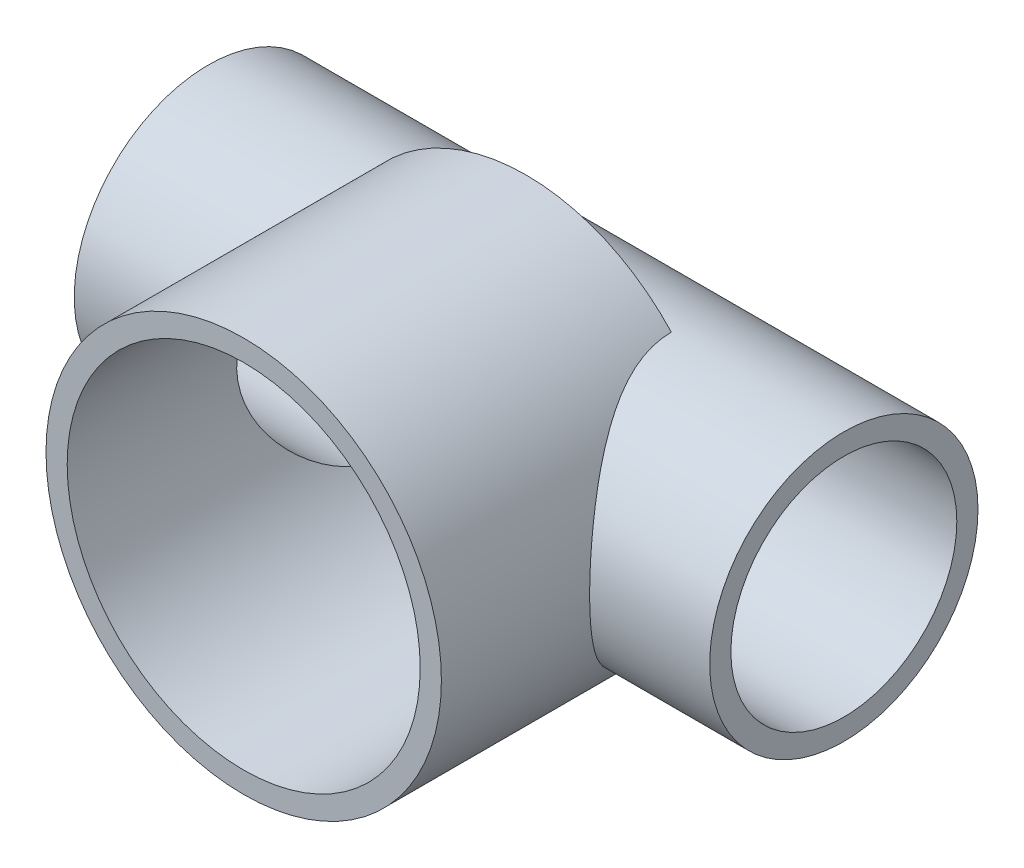
ISO-10303-21;
HEADER;
FILE_DESCRIPTION(('STEP AP214'),'2;1');
FILE_NAME('part.step','',(''),(''),'','','');
FILE_SCHEMA(('AUTOMOTIVE_DESIGN { 1 0 10303 214 1 1 1 1 }'));
ENDSEC;
DATA;
#1=APPLICATION_CONTEXT('core data for automotive mechanical design processes');
#2=APPLICATION_PROTOCOL_DEFINITION('international standard','automotive_design',2000,#1);
#3=PRODUCT_CONTEXT('',#1,'mechanical');
#4=PRODUCT('Part','Part','',(#3));
#5=PRODUCT_RELATED_PRODUCT_CATEGORY('part','',(#4));
#6=PRODUCT_DEFINITION_FORMATION('','',#4);
#7=PRODUCT_DEFINITION_CONTEXT('part definition',#1,'design');
#8=PRODUCT_DEFINITION('design','',#6,#7);
#9=PRODUCT_DEFINITION_SHAPE('','',#8);
#10=(LENGTH_UNIT() NAMED_UNIT(*) SI_UNIT(.MILLI.,.METRE.));
#11=(NAMED_UNIT(*) PLANE_ANGLE_UNIT() SI_UNIT($,.RADIAN.));
#12=(NAMED_UNIT(*) SI_UNIT($,.STERADIAN.) SOLID_ANGLE_UNIT());
#13=UNCERTAINTY_MEASURE_WITH_UNIT(LENGTH_MEASURE(1.E-05),#10,'distance_accuracy_value','');
#14=(GEOMETRIC_REPRESENTATION_CONTEXT(3) GLOBAL_UNCERTAINTY_ASSIGNED_CONTEXT((#13)) GLOBAL_UNIT_ASSIGNED_CONTEXT((#10,
#11,#12)) REPRESENTATION_CONTEXT('',''));
#15=CARTESIAN_POINT('',(0.,0.,0.));
#16=DIRECTION('',(0.,0.,1.));
#17=DIRECTION('',(1.,0.,0.));
#18=AXIS2_PLACEMENT_3D('',#15,#16,#17);
#19=CARTESIAN_POINT('',(-22.5,0.,0.));
#20=DIRECTION('',(1.,0.,0.));
#21=DIRECTION('',(0.,0.,-1.));
#22=AXIS2_PLACEMENT_3D('',#19,#20,#21);
#23=CYLINDRICAL_SURFACE('',#22,9.5);
#24=CARTESIAN_POINT('',(-22.5,0.,0.));
#25=DIRECTION('',(1.,0.,0.));
#26=DIRECTION('',(0.,0.,-1.));
#27=AXIS2_PLACEMENT_3D('',#24,#25,#26);
#28=CIRCLE('',#27,9.5);
#29=CARTESIAN_POINT('',(-22.5,0.,-9.5));
#30=VERTEX_POINT('',#29);
#31=EDGE_CURVE('E136',#30,#30,#28,.T.);
#32=ORIENTED_EDGE('',*,*,#31,.T.);
#33=EDGE_LOOP('',(#32));
#34=FACE_BOUND('',#33,.T.);
#35=CARTESIAN_POINT('',(22.5,0.,0.));
#36=DIRECTION('',(1.,0.,0.));
#37=DIRECTION('',(0.,0.,-1.));
#38=AXIS2_PLACEMENT_3D('',#35,#36,#37);
#39=CIRCLE('',#38,9.5);
#40=CARTESIAN_POINT('',(22.5,0.,-9.5));
#41=VERTEX_POINT('',#40);
#42=EDGE_CURVE('E130',#41,#41,#39,.T.);
#43=ORIENTED_EDGE('',*,*,#42,.F.);
#44=EDGE_LOOP('',(#43));
#45=FACE_BOUND('',#44,.T.);
#46=DIRECTION('',(1.,0.,0.));
#47=VECTOR('',#46,1.);
#48=CARTESIAN_POINT('',(-22.5,-9.5,0.));
#49=LINE('',#48,#47);
#50=CARTESIAN_POINT('',(8.12403840463597,-9.49999999999999,0.));
#51=VERTEX_POINT('',#50);
#52=CARTESIAN_POINT('',(10.2834819006016,-9.5,0.));
#53=VERTEX_POINT('',#52);
#54=EDGE_CURVE('E52',#51,#53,#49,.T.);
#55=ORIENTED_EDGE('',*,*,#54,.F.);
#56=DIRECTION('',(1.,0.,0.));
#57=VECTOR('',#56,1.);
#58=CARTESIAN_POINT('',(-22.5,-9.5,0.));
#59=LINE('',#58,#57);
#60=CARTESIAN_POINT('',(-8.12403840463597,-9.49999999999999,0.));
#61=VERTEX_POINT('',#60);
#62=EDGE_CURVE('E124',#51,#61,#59,.F.);
#63=ORIENTED_EDGE('',*,*,#62,.T.);
#64=CARTESIAN_POINT('',(-10.2834819006016,-9.5,0.));
#65=VERTEX_POINT('',#64);
#66=EDGE_CURVE('E145',#65,#61,#49,.T.);
#67=ORIENTED_EDGE('',*,*,#66,.F.);
#68=CARTESIAN_POINT('',(-10.2834819006016,9.5,0.));
#69=CARTESIAN_POINT('',(-10.2834761364737,9.50000195634698,0.116116420304368));
#70=CARTESIAN_POINT('',(-10.2854496183139,9.49787048239969,0.232212886387463));
#71=CARTESIAN_POINT('',(-10.293298161521,9.48936575210393,0.464106132486617));
#72=CARTESIAN_POINT('',(-10.2991728056426,9.48299294938273,0.579902943222542));
#73=CARTESIAN_POINT('',(-10.3225376393003,9.45757789669437,0.926104359572604));
#74=CARTESIAN_POINT('',(-10.3457691124083,9.4322388185315,1.15571075994757));
#75=CARTESIAN_POINT('',(-10.4060834063174,9.36564983541958,1.60823329762808));
#76=CARTESIAN_POINT('',(-10.4430218247337,9.32456566179096,1.83119388507449));
#77=CARTESIAN_POINT('',(-10.5291344428449,9.2272175808987,2.27140754865141));
#78=CARTESIAN_POINT('',(-10.5783124509071,9.17094894850704,2.48865882501569));
#79=CARTESIAN_POINT('',(-10.6866872793734,9.04442332131796,2.91506346063425));
#80=CARTESIAN_POINT('',(-10.745826915495,8.97424578514781,3.1242551064598));
#81=CARTESIAN_POINT('',(-10.8723530419598,8.82053702722909,3.53500195858929));
#82=CARTESIAN_POINT('',(-10.9397390730177,8.737006549097,3.73655758936513));
#83=CARTESIAN_POINT('',(-11.1518568528908,8.46689873983069,4.33023577346339));
#84=CARTESIAN_POINT('',(-11.3062868781779,8.26109660468008,4.71040307743858));
#85=CARTESIAN_POINT('',(-11.5597611900195,7.89926698456248,5.2833362803433));
#86=CARTESIAN_POINT('',(-11.6548924100877,7.75852767877047,5.48786699038516));
#87=CARTESIAN_POINT('',(-11.846989385461,7.46190438027195,5.88483928078707));
#88=CARTESIAN_POINT('',(-11.9439552688377,7.30601932712836,6.07728001310577));
#89=CARTESIAN_POINT('',(-12.1376206716782,6.97955732371625,6.44958311313042));
#90=CARTESIAN_POINT('',(-12.234320034431,6.8089730949888,6.62943916859778));
#91=CARTESIAN_POINT('',(-12.4254421927342,6.45361062387452,6.97584925542304));
#92=CARTESIAN_POINT('',(-12.5198650174667,6.26883256356031,7.14240345735575));
#93=CARTESIAN_POINT('',(-12.7186913948814,5.85619622827467,7.48582706288249));
#94=CARTESIAN_POINT('',(-12.8224139012961,5.62607055286564,7.66038065358647));
#95=CARTESIAN_POINT('',(-13.0215786987097,5.14834574182557,7.98928239408388));
#96=CARTESIAN_POINT('',(-13.1170195854649,4.90074365572509,8.14362711948091));
#97=CARTESIAN_POINT('',(-13.2967777208505,4.38964449642598,8.43010776954315));
#98=CARTESIAN_POINT('',(-13.3811104824855,4.12617035557796,8.56227473871609));
#99=CARTESIAN_POINT('',(-13.5362035188708,3.58474444246897,8.80268403006087));
#100=CARTESIAN_POINT('',(-13.6069692248383,3.30679852050986,8.91093592866297));
#101=CARTESIAN_POINT('',(-13.7165109067791,2.81144734182597,9.07719671664365));
#102=CARTESIAN_POINT('',(-13.7588393300131,2.59674411260979,9.14097436916183));
#103=CARTESIAN_POINT('',(-13.8338460740523,2.16179686194062,9.25348914040909));
#104=CARTESIAN_POINT('',(-13.86652633431,1.94155396373266,9.30222928203437));
#105=CARTESIAN_POINT('',(-13.9215304809538,1.49703564000524,9.38402506606801));
#106=CARTESIAN_POINT('',(-13.9438607236861,1.27276277759822,9.41709033530709));
#107=CARTESIAN_POINT('',(-13.9777013765814,0.821603446493448,9.46712609321157));
#108=CARTESIAN_POINT('',(-13.9892114287572,0.594716891572758,9.48409604936193));
#109=CARTESIAN_POINT('',(-14.0011571399606,0.139631481326823,9.50170739989634));
#110=CARTESIAN_POINT('',(-14.0015739768801,-0.0885689473732186,9.50232104215701));
#111=CARTESIAN_POINT('',(-13.9912758947363,-0.544168016256279,9.48714034922674));
#112=CARTESIAN_POINT('',(-13.980561016888,-0.77156665940478,9.4713460747861));
#113=CARTESIAN_POINT('',(-13.9482415319418,-1.22392531481256,9.42357418956101));
#114=CARTESIAN_POINT('',(-13.9266342380532,-1.44888471140005,9.39159258590192));
#115=CARTESIAN_POINT('',(-13.8730107431614,-1.89472694645676,9.3118900064261));
#116=CARTESIAN_POINT('',(-13.8409945060719,-2.11560977079026,9.26416897604296));
#117=CARTESIAN_POINT('',(-13.7679232757848,-2.5478305297451,9.15463504983768));
#118=CARTESIAN_POINT('',(-13.7270471152782,-2.75926953508596,9.09310020689698));
#119=CARTESIAN_POINT('',(-13.636708283683,-3.17578652829381,8.95614103847932));
#120=CARTESIAN_POINT('',(-13.5872425928186,-3.38086224906724,8.8807118276637));
#121=CARTESIAN_POINT('',(-13.4806528556035,-3.78356626929836,8.71675855910693));
#122=CARTESIAN_POINT('',(-13.4235310168639,-3.98119669460298,8.62823827535188));
#123=CARTESIAN_POINT('',(-13.3025726358193,-4.36837716023813,8.43882405106501));
#124=CARTESIAN_POINT('',(-13.2387336692241,-4.55792424827346,8.33792564092722));
#125=CARTESIAN_POINT('',(-13.0978833813305,-4.94907789450227,8.11252986413052));
#126=CARTESIAN_POINT('',(-13.0201979061123,-5.14964804172309,7.9866547859044));
#127=CARTESIAN_POINT('',(-12.8592155584319,-5.53940985633381,7.72143361694225));
#128=CARTESIAN_POINT('',(-12.7759162625032,-5.72859654194878,7.58208169686182));
#129=CARTESIAN_POINT('',(-12.6051454478716,-6.09518062454439,7.29065488952119));
#130=CARTESIAN_POINT('',(-12.51767049949,-6.27256803370428,7.13856946350712));
#131=CARTESIAN_POINT('',(-12.3401370547041,-6.61499975856,6.82246905093191));
#132=CARTESIAN_POINT('',(-12.2500783180239,-6.78004292113838,6.65845295270254));
#133=CARTESIAN_POINT('',(-12.0536647978624,-7.12423763105689,6.29038961760441));
#134=CARTESIAN_POINT('',(-11.9471265417025,-7.30106443811849,6.08425983102993));
#135=CARTESIAN_POINT('',(-11.7353758672741,-7.63677609046947,5.65715917811727));
#136=CARTESIAN_POINT('',(-11.6301637301686,-7.79565718593116,5.43618522535801));
#137=CARTESIAN_POINT('',(-11.4240714918934,-8.09466182687044,4.98004065897469));
#138=CARTESIAN_POINT('',(-11.3231904370451,-8.23478951627467,4.74487319839985));
#139=CARTESIAN_POINT('',(-11.1290646292772,-8.495310377135,4.26088926707647));
#140=CARTESIAN_POINT('',(-11.0358171723603,-8.61571055180142,4.01207768199995));
#141=CARTESIAN_POINT('',(-10.8820655120825,-8.80862846453454,3.56400522188913));
#142=CARTESIAN_POINT('',(-10.8191313668662,-8.88565468465092,3.36751122141205));
#143=CARTESIAN_POINT('',(-10.7014280333993,-9.0270649051188,2.96766651145778));
#144=CARTESIAN_POINT('',(-10.6466567846934,-9.09145209708402,2.76431754823597));
#145=CARTESIAN_POINT('',(-10.5471472127593,-9.20670825035228,2.35206089181644));
#146=CARTESIAN_POINT('',(-10.5023804609474,-9.25761559394261,2.1431708861449));
#147=CARTESIAN_POINT('',(-10.4243354479701,-9.34541000104605,1.72043348351456));
#148=CARTESIAN_POINT('',(-10.391052080335,-9.38230329711149,1.50658833528846));
#149=CARTESIAN_POINT('',(-10.337717459323,-9.44103628927873,1.07834834082955));
#150=CARTESIAN_POINT('',(-10.3174821087236,-9.46308562731314,0.864006002965382));
#151=CARTESIAN_POINT('',(-10.2971373633421,-9.48520162019166,0.540970691960808));
#152=CARTESIAN_POINT('',(-10.2920237366161,-9.49074732753318,0.432926131838216));
#153=CARTESIAN_POINT('',(-10.285193644911,-9.49814744912526,0.216593045431907));
#154=CARTESIAN_POINT('',(-10.2834775153144,-9.50000149895555,0.108304496119118));
#155=CARTESIAN_POINT('',(-10.2834819006016,-9.5,0.));
#156=B_SPLINE_CURVE_WITH_KNOTS('',3,(#68,#69,#70,#71,#72,#73,#74,#75,#76,#77,#78,#79,#80,#81,
#82,#83,#84,#85,#86,#87,#88,#89,#90,#91,#92,#93,#94,#95,#96,#97,#98,#99,#100,#101,#102,#103,
#104,#105,#106,#107,#108,#109,#110,#111,#112,#113,#114,#115,#116,#117,#118,#119,#120,#121,#122,
#123,#124,#125,#126,#127,#128,#129,#130,#131,#132,#133,#134,#135,#136,#137,#138,#139,#140,#141,
#142,#143,#144,#145,#146,#147,#148,#149,#150,#151,#152,#153,#154,#155),.UNSPECIFIED.,.F.,.F.,(4,
2,2,2,2,2,2,2,2,2,2,2,2,2,2,2,2,2,2,2,2,2,2,2,2,2,2,2,2,2,2,2,2,2,2,2,2,2,2,2,2,2,2,4),(0.,
0.348274045027575,0.696510846721538,1.39181723463766,2.0799974447671,2.76839205152788,
3.45296182848786,4.13749349548329,5.5096564140869,6.30673849525484,7.10387642479528,
7.90141135942029,8.69893606530469,9.61838727277648,10.537994080366,11.4563026816919,
12.3742428909308,13.057359198528,13.7403380939419,14.4228969880013,15.1054784638019,
15.7892180172608,16.4729550391839,17.1568607984966,17.8407689288411,18.5119807399041,
19.1834290048965,19.8546840760664,20.5261822474867,21.273095300943,22.0203328855198,
22.7681951455095,23.5161271787934,24.3903746137587,25.2648043895655,26.1390406230944,
27.0129658297255,27.6731193633722,28.3331059796616,28.9911926459049,29.6489862936496,
30.2972832490492,30.6221040404588,30.946956894813),.UNSPECIFIED.);
#157=CARTESIAN_POINT('',(-10.2834819006016,9.5,0.));
#158=VERTEX_POINT('',#157);
#159=EDGE_CURVE('E59',#158,#65,#156,.T.);
#160=ORIENTED_EDGE('',*,*,#159,.F.);
#161=DIRECTION('',(1.,0.,0.));
#162=VECTOR('',#161,1.);
#163=CARTESIAN_POINT('',(-22.5,9.5,0.));
#164=LINE('',#163,#162);
#165=CARTESIAN_POINT('',(-8.12403840463597,9.49999999999999,0.));
#166=VERTEX_POINT('',#165);
#167=EDGE_CURVE('E142',#166,#158,#164,.F.);
#168=ORIENTED_EDGE('',*,*,#167,.F.);
#169=DIRECTION('',(1.,0.,0.));
#170=VECTOR('',#169,1.);
#171=CARTESIAN_POINT('',(-22.5,9.5,0.));
#172=LINE('',#171,#170);
#173=CARTESIAN_POINT('',(8.12403840463596,9.5,0.));
#174=VERTEX_POINT('',#173);
#175=EDGE_CURVE('E114',#166,#174,#172,.T.);
#176=ORIENTED_EDGE('',*,*,#175,.T.);
#177=CARTESIAN_POINT('',(10.2834819006016,9.5,0.));
#178=VERTEX_POINT('',#177);
#179=EDGE_CURVE('E139',#178,#174,#164,.F.);
#180=ORIENTED_EDGE('',*,*,#179,.F.);
#181=CARTESIAN_POINT('',(10.2834819006016,-9.5,0.));
#182=CARTESIAN_POINT('',(10.2834761364737,-9.50000195634698,0.116116420304368));
#183=CARTESIAN_POINT('',(10.2854496183139,-9.49787048239969,0.232212886387464));
#184=CARTESIAN_POINT('',(10.293298161521,-9.48936575210393,0.464106132486617));
#185=CARTESIAN_POINT('',(10.2991728056426,-9.48299294938273,0.579902943222542));
#186=CARTESIAN_POINT('',(10.3225376393003,-9.45757789669437,0.926104359572605));
#187=CARTESIAN_POINT('',(10.3457691124083,-9.4322388185315,1.15571075994757));
#188=CARTESIAN_POINT('',(10.4060834063174,-9.36564983541958,1.60823329762808));
#189=CARTESIAN_POINT('',(10.4430218247337,-9.32456566179096,1.83119388507449));
#190=CARTESIAN_POINT('',(10.5291344428449,-9.2272175808987,2.27140754865141));
#191=CARTESIAN_POINT('',(10.5783124509071,-9.17094894850704,2.48865882501569));
#192=CARTESIAN_POINT('',(10.6866872793734,-9.04442332131796,2.91506346063425));
#193=CARTESIAN_POINT('',(10.745826915495,-8.97424578514781,3.12425510645979));
#194=CARTESIAN_POINT('',(10.8723530419598,-8.82053702722909,3.53500195858929));
#195=CARTESIAN_POINT('',(10.9397390730177,-8.737006549097,3.73655758936513));
#196=CARTESIAN_POINT('',(11.1518568528908,-8.46689873983069,4.33023577346339));
#197=CARTESIAN_POINT('',(11.3062868781779,-8.26109660468009,4.71040307743858));
#198=CARTESIAN_POINT('',(11.5597611900195,-7.89926698456248,5.28333628034329));
#199=CARTESIAN_POINT('',(11.6548924100877,-7.75852767877047,5.48786699038515));
#200=CARTESIAN_POINT('',(11.846989385461,-7.46190438027195,5.88483928078706));
#201=CARTESIAN_POINT('',(11.9439552688377,-7.30601932712836,6.07728001310577));
#202=CARTESIAN_POINT('',(12.1376206716782,-6.97955732371626,6.44958311313041));
#203=CARTESIAN_POINT('',(12.234320034431,-6.8089730949888,6.62943916859777));
#204=CARTESIAN_POINT('',(12.4254421927342,-6.45361062387453,6.97584925542304));
#205=CARTESIAN_POINT('',(12.5198650174667,-6.26883256356031,7.14240345735574));
#206=CARTESIAN_POINT('',(12.7186913948814,-5.85619622827467,7.48582706288249));
#207=CARTESIAN_POINT('',(12.8224139012961,-5.62607055286564,7.66038065358646));
#208=CARTESIAN_POINT('',(13.0215786987097,-5.14834574182558,7.98928239408388));
#209=CARTESIAN_POINT('',(13.1170195854649,-4.90074365572509,8.14362711948091));
#210=CARTESIAN_POINT('',(13.2967777208505,-4.38964449642599,8.43010776954315));
#211=CARTESIAN_POINT('',(13.3811104824855,-4.12617035557797,8.56227473871609));
#212=CARTESIAN_POINT('',(13.5362035188708,-3.58474444246897,8.80268403006087));
#213=CARTESIAN_POINT('',(13.6069692248383,-3.30679852050986,8.91093592866297));
#214=CARTESIAN_POINT('',(13.7165109067791,-2.81144734182597,9.07719671664364));
#215=CARTESIAN_POINT('',(13.7588393300131,-2.59674411260979,9.14097436916183));
#216=CARTESIAN_POINT('',(13.8338460740523,-2.16179686194062,9.25348914040909));
#217=CARTESIAN_POINT('',(13.86652633431,-1.94155396373266,9.30222928203437));
#218=CARTESIAN_POINT('',(13.9215304809538,-1.49703564000524,9.38402506606801));
#219=CARTESIAN_POINT('',(13.9438607236861,-1.27276277759822,9.41709033530709));
#220=CARTESIAN_POINT('',(13.9777013765814,-0.821603446493448,9.46712609321157));
#221=CARTESIAN_POINT('',(13.9892114287572,-0.594716891572758,9.48409604936193));
#222=CARTESIAN_POINT('',(14.0011571399606,-0.139631481326824,9.50170739989634));
#223=CARTESIAN_POINT('',(14.0015739768801,0.088568947373217,9.50232104215701));
#224=CARTESIAN_POINT('',(13.9912758947363,0.544168016256277,9.48714034922674));
#225=CARTESIAN_POINT('',(13.980561016888,0.771566659404778,9.4713460747861));
#226=CARTESIAN_POINT('',(13.9482415319418,1.22392531481255,9.42357418956101));
#227=CARTESIAN_POINT('',(13.9266342380532,1.44888471140005,9.39159258590192));
#228=CARTESIAN_POINT('',(13.8730107431614,1.89472694645676,9.3118900064261));
#229=CARTESIAN_POINT('',(13.8409945060719,2.11560977079026,9.26416897604296));
#230=CARTESIAN_POINT('',(13.7679232757848,2.5478305297451,9.15463504983768));
#231=CARTESIAN_POINT('',(13.7270471152782,2.75926953508596,9.09310020689698));
#232=CARTESIAN_POINT('',(13.636708283683,3.17578652829381,8.95614103847932));
#233=CARTESIAN_POINT('',(13.5872425928186,3.38086224906724,8.8807118276637));
#234=CARTESIAN_POINT('',(13.4806528556035,3.78356626929837,8.71675855910693));
#235=CARTESIAN_POINT('',(13.4235310168639,3.98119669460298,8.62823827535187));
#236=CARTESIAN_POINT('',(13.3025726358193,4.36837716023813,8.43882405106501));
#237=CARTESIAN_POINT('',(13.2387336692241,4.55792424827346,8.33792564092722));
#238=CARTESIAN_POINT('',(13.0978833813305,4.94907789450227,8.11252986413052));
#239=CARTESIAN_POINT('',(13.0201979061122,5.14964804172309,7.98665478590439));
#240=CARTESIAN_POINT('',(12.8592155584319,5.53940985633381,7.72143361694225));
#241=CARTESIAN_POINT('',(12.7759162625032,5.72859654194878,7.58208169686181));
#242=CARTESIAN_POINT('',(12.6051454478716,6.09518062454439,7.29065488952118));
#243=CARTESIAN_POINT('',(12.51767049949,6.27256803370428,7.13856946350712));
#244=CARTESIAN_POINT('',(12.3401370547041,6.61499975856,6.82246905093191));
#245=CARTESIAN_POINT('',(12.2500783180239,6.78004292113838,6.65845295270253));
#246=CARTESIAN_POINT('',(12.0536647978624,7.1242376310569,6.29038961760441));
#247=CARTESIAN_POINT('',(11.9471265417025,7.30106443811849,6.08425983102992));
#248=CARTESIAN_POINT('',(11.7353758672741,7.63677609046947,5.65715917811727));
#249=CARTESIAN_POINT('',(11.6301637301686,7.79565718593117,5.436185225358));
#250=CARTESIAN_POINT('',(11.4240714918934,8.09466182687044,4.98004065897469));
#251=CARTESIAN_POINT('',(11.3231904370451,8.23478951627467,4.74487319839985));
#252=CARTESIAN_POINT('',(11.1290646292772,8.495310377135,4.26088926707646));
#253=CARTESIAN_POINT('',(11.0358171723603,8.61571055180142,4.01207768199994));
#254=CARTESIAN_POINT('',(10.8820655120825,8.80862846453455,3.56400522188912));
#255=CARTESIAN_POINT('',(10.8191313668662,8.88565468465092,3.36751122141204));
#256=CARTESIAN_POINT('',(10.7014280333993,9.0270649051188,2.96766651145777));
#257=CARTESIAN_POINT('',(10.6466567846934,9.09145209708402,2.76431754823596));
#258=CARTESIAN_POINT('',(10.5471472127593,9.20670825035228,2.35206089181644));
#259=CARTESIAN_POINT('',(10.5023804609474,9.25761559394261,2.14317088614489));
#260=CARTESIAN_POINT('',(10.4243354479701,9.34541000104605,1.72043348351456));
#261=CARTESIAN_POINT('',(10.391052080335,9.38230329711149,1.50658833528845));
#262=CARTESIAN_POINT('',(10.337717459323,9.44103628927873,1.07834834082954));
#263=CARTESIAN_POINT('',(10.3174821087236,9.46308562731314,0.864006002965378));
#264=CARTESIAN_POINT('',(10.2971373633421,9.48520162019167,0.540970691960806));
#265=CARTESIAN_POINT('',(10.2920237366161,9.49074732753318,0.432926131838215));
#266=CARTESIAN_POINT('',(10.285193644911,9.49814744912526,0.216593045431907));
#267=CARTESIAN_POINT('',(10.2834775153144,9.50000149895555,0.108304496119119));
#268=CARTESIAN_POINT('',(10.2834819006016,9.5,0.));
#269=B_SPLINE_CURVE_WITH_KNOTS('',3,(#181,#182,#183,#184,#185,#186,#187,#188,#189,#190,#191,
#192,#193,#194,#195,#196,#197,#198,#199,#200,#201,#202,#203,#204,#205,#206,#207,#208,#209,#210,
#211,#212,#213,#214,#215,#216,#217,#218,#219,#220,#221,#222,#223,#224,#225,#226,#227,#228,#229,
#230,#231,#232,#233,#234,#235,#236,#237,#238,#239,#240,#241,#242,#243,#244,#245,#246,#247,#248,
#249,#250,#251,#252,#253,#254,#255,#256,#257,#258,#259,#260,#261,#262,#263,#264,#265,#266,#267,
#268),.UNSPECIFIED.,.F.,.F.,(4,2,2,2,2,2,2,2,2,2,2,2,2,2,2,2,2,2,2,2,2,2,2,2,2,2,2,2,2,2,2,2,2,
2,2,2,2,2,2,2,2,2,2,4),(0.,0.348274045027575,0.696510846721539,1.39181723463766,2.0799974447671,
2.76839205152787,3.45296182848786,4.13749349548328,5.5096564140869,6.30673849525483,
7.10387642479527,7.90141135942028,8.69893606530469,9.61838727277648,10.537994080366,
11.4563026816919,12.3742428909308,13.057359198528,13.7403380939419,14.4228969880013,
15.1054784638019,15.7892180172608,16.4729550391839,17.1568607984966,17.8407689288411,
18.5119807399041,19.1834290048965,19.8546840760664,20.5261822474867,21.273095300943,
22.0203328855198,22.7681951455095,23.5161271787934,24.3903746137587,25.2648043895655,
26.1390406230944,27.0129658297255,27.6731193633723,28.3331059796616,28.9911926459049,
29.6489862936496,30.2972832490492,30.6221040404588,30.946956894813),.UNSPECIFIED.);
#270=EDGE_CURVE('E144',#53,#178,#269,.T.);
#271=ORIENTED_EDGE('',*,*,#270,.F.);
#272=EDGE_LOOP('',(#55,#63,#67,#160,#168,#176,#180,#271));
#273=FACE_BOUND('',#272,.T.);
#274=ADVANCED_FACE('F35',(#34,#45,#273),#23,.T.);
#275=CARTESIAN_POINT('',(-22.5,0.,0.));
#276=DIRECTION('',(1.,0.,0.));
#277=DIRECTION('',(0.,0.,-1.));
#278=AXIS2_PLACEMENT_3D('',#275,#276,#277);
#279=CYLINDRICAL_SURFACE('',#278,8.);
#280=CARTESIAN_POINT('',(-9.60468635614927,8.,0.));
#281=CARTESIAN_POINT('',(-9.60468224233303,8.00000141304583,0.0995040732964209));
#282=CARTESIAN_POINT('',(-9.60623339866748,7.99814304728993,0.198991984130615));
#283=CARTESIAN_POINT('',(-9.61240527336166,7.99072581826309,0.397726040153467));
#284=CARTESIAN_POINT('',(-9.61702572752546,7.98516727349234,0.496972205412949));
#285=CARTESIAN_POINT('',(-9.6354124904836,7.96299057499208,0.793777274687159));
#286=CARTESIAN_POINT('',(-9.65370443324247,7.94087123835747,0.99068763824583));
#287=CARTESIAN_POINT('',(-9.70130000044093,7.88264935054873,1.37916442999934));
#288=CARTESIAN_POINT('',(-9.73050212928276,7.84667559242711,1.57076314679851));
#289=CARTESIAN_POINT('',(-9.79871078614678,7.76133013863568,1.94920235046317));
#290=CARTESIAN_POINT('',(-9.83771976960939,7.71195508730295,2.13604163273903));
#291=CARTESIAN_POINT('',(-9.92388648272242,7.60074939401936,2.50304040721119));
#292=CARTESIAN_POINT('',(-9.9710060705514,7.5389768378683,2.6832265749715));
#293=CARTESIAN_POINT('',(-10.0719882412899,7.40352559721752,3.03705497204877));
#294=CARTESIAN_POINT('',(-10.1258505449202,7.32984740580513,3.21069747201309));
#295=CARTESIAN_POINT('',(-10.2955604944708,7.09150767376509,3.7218388140077));
#296=CARTESIAN_POINT('',(-10.419357263915,6.90975542793217,4.04885465146364));
#297=CARTESIAN_POINT('',(-10.6949351468187,6.4763474267689,4.71556171291436));
#298=CARTESIAN_POINT('',(-10.8482046952856,6.21845921071261,5.05058327778888));
#299=CARTESIAN_POINT('',(-11.0769557492443,5.79456632154743,5.51973279179602));
#300=CARTESIAN_POINT('',(-11.1530512551135,5.64700973336636,5.67061854025674));
#301=CARTESIAN_POINT('',(-11.3033321837511,5.33983889717943,5.96076818566804));
#302=CARTESIAN_POINT('',(-11.3775171812615,5.18022199525876,6.10002951034943));
#303=CARTESIAN_POINT('',(-11.5317748204537,4.82801900765597,6.38339422109433));
#304=CARTESIAN_POINT('',(-11.6113651463336,4.63384064591592,6.52578764925346));
#305=CARTESIAN_POINT('',(-11.7638886120212,4.23168312610443,6.7934648925066));
#306=CARTESIAN_POINT('',(-11.8368248061227,4.02371037623523,6.91875657066145));
#307=CARTESIAN_POINT('',(-11.973978691312,3.59505834658488,7.1508689815789));
#308=CARTESIAN_POINT('',(-12.0382000546619,3.37438447498797,7.25769749958717));
#309=CARTESIAN_POINT('',(-12.1559900923739,2.92173839098291,7.45144376933429));
#310=CARTESIAN_POINT('',(-12.2095608237711,2.68976837107883,7.53836536633765));
#311=CARTESIAN_POINT('',(-12.2992963411693,2.24141445663474,7.68280807159502));
#312=CARTESIAN_POINT('',(-12.3367006791395,2.02596527337801,7.74246253060608));
#313=CARTESIAN_POINT('',(-12.4005204649497,1.58926501961399,7.84375285129431));
#314=CARTESIAN_POINT('',(-12.4269366128226,1.36801431966325,7.88538986082955));
#315=CARTESIAN_POINT('',(-12.4679666346415,0.921918504819718,7.94989377100727));
#316=CARTESIAN_POINT('',(-12.4825915414745,0.697076951240632,7.97277821846916));
#317=CARTESIAN_POINT('',(-12.4996213339587,0.245812147283447,7.99941512347482));
#318=CARTESIAN_POINT('',(-12.5020277335588,0.0193890963442833,8.00316995129735));
#319=CARTESIAN_POINT('',(-12.4950812293771,-0.400892872585676,7.992312541917));
#320=CARTESIAN_POINT('',(-12.4873357781724,-0.594849616534771,7.98021108816972));
#321=CARTESIAN_POINT('',(-12.4629602831515,-0.980817370074196,7.94201468423938));
#322=CARTESIAN_POINT('',(-12.4463303676457,-1.17282840772382,7.91591993614895));
#323=CARTESIAN_POINT('',(-12.4045627579956,-1.55354479940374,7.85008428622321));
#324=CARTESIAN_POINT('',(-12.3794251035156,-1.74225016884118,7.81034344800772));
#325=CARTESIAN_POINT('',(-12.3211922140617,-2.11514586104975,7.71771167390652));
#326=CARTESIAN_POINT('',(-12.2880966401408,-2.29933599113755,7.66482017789908));
#327=CARTESIAN_POINT('',(-12.214627597281,-2.66216629579071,7.546474804968));
#328=CARTESIAN_POINT('',(-12.1742531802491,-2.84080574380381,7.48101929146817));
#329=CARTESIAN_POINT('',(-12.0870222549264,-3.19164933628257,7.33820760242004));
#330=CARTESIAN_POINT('',(-12.0401636025435,-3.36385132810263,7.26084748951752));
#331=CARTESIAN_POINT('',(-11.8911664491291,-3.86954439281121,7.01196136147132));
#332=CARTESIAN_POINT('',(-11.7805476037927,-4.19240445575051,6.82353638364865));
#333=CARTESIAN_POINT('',(-11.5292614913401,-4.84388864045297,6.38054226926606));
#334=CARTESIAN_POINT('',(-11.3865623181403,-5.16804019965961,6.12061260572338));
#335=CARTESIAN_POINT('',(-11.0930162010778,-5.77127191146829,5.55549337860916));
#336=CARTESIAN_POINT('',(-10.9421540969913,-6.05026407266145,5.25021762640013));
#337=CARTESIAN_POINT('',(-10.7089728495958,-6.44951527240847,4.73912310439818));
#338=CARTESIAN_POINT('',(-10.6250298698827,-6.58650325819804,4.54686397459123));
#339=CARTESIAN_POINT('',(-10.4612103082531,-6.84370430308565,4.14965974780478));
#340=CARTESIAN_POINT('',(-10.3813343981283,-6.96391459654598,3.94471256734364));
#341=CARTESIAN_POINT('',(-10.2287791230166,-7.1861108720141,3.5236727975778));
#342=CARTESIAN_POINT('',(-10.1560741331794,-7.28816287747734,3.30762442677684));
#343=CARTESIAN_POINT('',(-10.0205542071505,-7.47339763695894,2.86459812296676));
#344=CARTESIAN_POINT('',(-9.95773656142241,-7.55658556326946,2.6376232066204));
#345=CARTESIAN_POINT('',(-9.85524468058401,-7.68959581664068,2.2158149417255));
#346=CARTESIAN_POINT('',(-9.8134400144399,-7.74272808305297,2.02254173193782));
#347=CARTESIAN_POINT('',(-9.74024071418683,-7.83461347307286,1.63073488736891));
#348=CARTESIAN_POINT('',(-9.7088416629901,-7.87337269873744,1.43220352337443));
#349=CARTESIAN_POINT('',(-9.65759335211063,-7.93615592780333,1.02926106367877));
#350=CARTESIAN_POINT('',(-9.63786052541345,-7.96003151132141,0.824811376123509));
#351=CARTESIAN_POINT('',(-9.61801427341773,-7.98397740819798,0.516501011009391));
#352=CARTESIAN_POINT('',(-9.61302427015839,-7.98998150392752,0.413367795482637));
#353=CARTESIAN_POINT('',(-9.60635772268926,-7.99799384696251,0.206829092525695));
#354=CARTESIAN_POINT('',(-9.60468151808229,-8.00000168472587,0.103423578277178));
#355=CARTESIAN_POINT('',(-9.60468635614928,-8.,0.));
#356=B_SPLINE_CURVE_WITH_KNOTS('',3,(#280,#281,#282,#283,#284,#285,#286,#287,#288,#289,#290,
#291,#292,#293,#294,#295,#296,#297,#298,#299,#300,#301,#302,#303,#304,#305,#306,#307,#308,#309,
#310,#311,#312,#313,#314,#315,#316,#317,#318,#319,#320,#321,#322,#323,#324,#325,#326,#327,#328,
#329,#330,#331,#332,#333,#334,#335,#336,#337,#338,#339,#340,#341,#342,#343,#344,#345,#346,#347,
#348,#349,#350,#351,#352,#353,#354,#355),.UNSPECIFIED.,.F.,.F.,(4,2,2,2,2,2,2,2,2,2,2,2,2,2,2,2,
2,2,2,2,2,2,2,2,2,2,2,2,2,2,2,2,2,2,2,2,2,4),(0.,0.298451159992173,0.596876633534279,
1.19287652775549,1.7834646681595,2.3742008275601,2.9622312559059,3.55023733644728,
4.72847536015086,6.07218406537425,6.74470427115978,7.41737290083929,8.17718566415807,
8.93664789464182,9.69578910194652,10.4547835479607,11.1337686609438,11.8127105106822,
12.4910163450647,13.1692381310947,13.7520000320861,14.3347535169953,14.9175042850701,
15.5002798783136,16.0831314348934,16.6661761810958,17.8313667874966,19.1444936203106,
20.4601490094537,21.2110367173653,21.9620480559172,22.7102702891988,23.4582871206717,
24.071787270504,24.6850266605894,25.3042873632379,25.6144579719961,25.9246603658345),.UNSPECIFIED.);
#357=CARTESIAN_POINT('',(-9.60468635614928,8.,0.));
#358=VERTEX_POINT('',#357);
#359=CARTESIAN_POINT('',(-9.60468635614927,-8.,0.));
#360=VERTEX_POINT('',#359);
#361=EDGE_CURVE('E92',#358,#360,#356,.T.);
#362=ORIENTED_EDGE('',*,*,#361,.T.);
#363=DIRECTION('',(1.,0.,0.));
#364=VECTOR('',#363,1.);
#365=CARTESIAN_POINT('',(-22.5,-8.,0.));
#366=LINE('',#365,#364);
#367=CARTESIAN_POINT('',(9.60468635614927,-8.,0.));
#368=VERTEX_POINT('',#367);
#369=EDGE_CURVE('E119',#368,#360,#366,.F.);
#370=ORIENTED_EDGE('',*,*,#369,.F.);
#371=CARTESIAN_POINT('',(9.60468635614927,-8.,0.));
#372=CARTESIAN_POINT('',(9.60468224233303,-8.00000141304583,0.0995040732964207));
#373=CARTESIAN_POINT('',(9.60623339866748,-7.99814304728993,0.198991984130615));
#374=CARTESIAN_POINT('',(9.61240527336166,-7.99072581826309,0.397726040153466));
#375=CARTESIAN_POINT('',(9.61702572752546,-7.98516727349234,0.496972205412948));
#376=CARTESIAN_POINT('',(9.6354124904836,-7.96299057499208,0.793777274687158));
#377=CARTESIAN_POINT('',(9.65370443324247,-7.94087123835747,0.99068763824583));
#378=CARTESIAN_POINT('',(9.70130000044093,-7.88264935054873,1.37916442999934));
#379=CARTESIAN_POINT('',(9.73050212928276,-7.84667559242711,1.57076314679851));
#380=CARTESIAN_POINT('',(9.79871078614678,-7.76133013863568,1.94920235046317));
#381=CARTESIAN_POINT('',(9.83771976960939,-7.71195508730295,2.13604163273903));
#382=CARTESIAN_POINT('',(9.92388648272242,-7.60074939401936,2.50304040721119));
#383=CARTESIAN_POINT('',(9.9710060705514,-7.5389768378683,2.6832265749715));
#384=CARTESIAN_POINT('',(10.0719882412899,-7.40352559721752,3.03705497204877));
#385=CARTESIAN_POINT('',(10.1258505449202,-7.32984740580514,3.21069747201308));
#386=CARTESIAN_POINT('',(10.2955604944708,-7.09150767376509,3.7218388140077));
#387=CARTESIAN_POINT('',(10.419357263915,-6.90975542793217,4.04885465146363));
#388=CARTESIAN_POINT('',(10.6949351468187,-6.4763474267689,4.71556171291436));
#389=CARTESIAN_POINT('',(10.8482046952856,-6.21845921071261,5.05058327778888));
#390=CARTESIAN_POINT('',(11.0769557492443,-5.79456632154743,5.51973279179602));
#391=CARTESIAN_POINT('',(11.1530512551135,-5.64700973336636,5.67061854025674));
#392=CARTESIAN_POINT('',(11.3033321837511,-5.33983889717944,5.96076818566803));
#393=CARTESIAN_POINT('',(11.3775171812615,-5.18022199525876,6.10002951034942));
#394=CARTESIAN_POINT('',(11.5317748204537,-4.82801900765597,6.38339422109433));
#395=CARTESIAN_POINT('',(11.6113651463336,-4.63384064591592,6.52578764925346));
#396=CARTESIAN_POINT('',(11.7638886120212,-4.23168312610443,6.79346489250659));
#397=CARTESIAN_POINT('',(11.8368248061227,-4.02371037623523,6.91875657066145));
#398=CARTESIAN_POINT('',(11.973978691312,-3.59505834658488,7.15086898157889));
#399=CARTESIAN_POINT('',(12.0382000546619,-3.37438447498797,7.25769749958717));
#400=CARTESIAN_POINT('',(12.1559900923739,-2.92173839098292,7.45144376933429));
#401=CARTESIAN_POINT('',(12.2095608237711,-2.68976837107884,7.53836536633765));
#402=CARTESIAN_POINT('',(12.2992963411693,-2.24141445663474,7.68280807159502));
#403=CARTESIAN_POINT('',(12.3367006791395,-2.02596527337801,7.74246253060608));
#404=CARTESIAN_POINT('',(12.4005204649497,-1.58926501961399,7.84375285129431));
#405=CARTESIAN_POINT('',(12.4269366128226,-1.36801431966325,7.88538986082955));
#406=CARTESIAN_POINT('',(12.4679666346415,-0.921918504819722,7.94989377100727));
#407=CARTESIAN_POINT('',(12.4825915414745,-0.697076951240635,7.97277821846915));
#408=CARTESIAN_POINT('',(12.4996213339587,-0.24581214728345,7.99941512347482));
#409=CARTESIAN_POINT('',(12.5020277335588,-0.0193890963442859,8.00316995129735));
#410=CARTESIAN_POINT('',(12.4950812293771,0.400892872585674,7.992312541917));
#411=CARTESIAN_POINT('',(12.4873357781724,0.594849616534769,7.98021108816972));
#412=CARTESIAN_POINT('',(12.4629602831515,0.980817370074195,7.94201468423938));
#413=CARTESIAN_POINT('',(12.4463303676457,1.17282840772382,7.91591993614895));
#414=CARTESIAN_POINT('',(12.4045627579956,1.55354479940374,7.85008428622321));
#415=CARTESIAN_POINT('',(12.3794251035156,1.74225016884118,7.81034344800772));
#416=CARTESIAN_POINT('',(12.3211922140617,2.11514586104975,7.71771167390652));
#417=CARTESIAN_POINT('',(12.2880966401408,2.29933599113755,7.66482017789908));
#418=CARTESIAN_POINT('',(12.214627597281,2.66216629579071,7.546474804968));
#419=CARTESIAN_POINT('',(12.1742531802491,2.84080574380381,7.48101929146817));
#420=CARTESIAN_POINT('',(12.0870222549264,3.19164933628257,7.33820760242004));
#421=CARTESIAN_POINT('',(12.0401636025435,3.36385132810264,7.26084748951751));
#422=CARTESIAN_POINT('',(11.8911664491291,3.86954439281121,7.01196136147132));
#423=CARTESIAN_POINT('',(11.7805476037927,4.19240445575051,6.82353638364864));
#424=CARTESIAN_POINT('',(11.5292614913401,4.84388864045298,6.38054226926606));
#425=CARTESIAN_POINT('',(11.3865623181403,5.16804019965961,6.12061260572337));
#426=CARTESIAN_POINT('',(11.0930162010778,5.77127191146829,5.55549337860916));
#427=CARTESIAN_POINT('',(10.9421540969913,6.05026407266145,5.25021762640012));
#428=CARTESIAN_POINT('',(10.7089728495958,6.44951527240848,4.73912310439817));
#429=CARTESIAN_POINT('',(10.6250298698827,6.58650325819805,4.54686397459123));
#430=CARTESIAN_POINT('',(10.4612103082531,6.84370430308565,4.14965974780478));
#431=CARTESIAN_POINT('',(10.3813343981283,6.96391459654598,3.94471256734364));
#432=CARTESIAN_POINT('',(10.2287791230166,7.1861108720141,3.5236727975778));
#433=CARTESIAN_POINT('',(10.1560741331794,7.28816287747734,3.30762442677683));
#434=CARTESIAN_POINT('',(10.0205542071505,7.47339763695894,2.86459812296676));
#435=CARTESIAN_POINT('',(9.95773656142241,7.55658556326946,2.63762320662039));
#436=CARTESIAN_POINT('',(9.85524468058401,7.68959581664069,2.21581494172549));
#437=CARTESIAN_POINT('',(9.8134400144399,7.74272808305297,2.02254173193781));
#438=CARTESIAN_POINT('',(9.74024071418683,7.83461347307286,1.6307348873689));
#439=CARTESIAN_POINT('',(9.7088416629901,7.87337269873744,1.43220352337443));
#440=CARTESIAN_POINT('',(9.65759335211062,7.93615592780333,1.02926106367876));
#441=CARTESIAN_POINT('',(9.63786052541345,7.96003151132141,0.824811376123507));
#442=CARTESIAN_POINT('',(9.61801427341773,7.98397740819798,0.51650101100939));
#443=CARTESIAN_POINT('',(9.61302427015839,7.98998150392752,0.413367795482636));
#444=CARTESIAN_POINT('',(9.60635772268926,7.99799384696251,0.206829092525695));
#445=CARTESIAN_POINT('',(9.60468151808229,8.00000168472587,0.103423578277178));
#446=CARTESIAN_POINT('',(9.60468635614928,8.,0.));
#447=B_SPLINE_CURVE_WITH_KNOTS('',3,(#371,#372,#373,#374,#375,#376,#377,#378,#379,#380,#381,
#382,#383,#384,#385,#386,#387,#388,#389,#390,#391,#392,#393,#394,#395,#396,#397,#398,#399,#400,
#401,#402,#403,#404,#405,#406,#407,#408,#409,#410,#411,#412,#413,#414,#415,#416,#417,#418,#419,
#420,#421,#422,#423,#424,#425,#426,#427,#428,#429,#430,#431,#432,#433,#434,#435,#436,#437,#438,
#439,#440,#441,#442,#443,#444,#445,#446),.UNSPECIFIED.,.F.,.F.,(4,2,2,2,2,2,2,2,2,2,2,2,2,2,2,2,
2,2,2,2,2,2,2,2,2,2,2,2,2,2,2,2,2,2,2,2,2,4),(0.,0.298451159992172,0.596876633534278,
1.19287652775549,1.7834646681595,2.3742008275601,2.9622312559059,3.55023733644728,
4.72847536015085,6.07218406537425,6.74470427115978,7.41737290083929,8.17718566415807,
8.93664789464181,9.69578910194651,10.4547835479607,11.1337686609438,11.8127105106822,
12.4910163450647,13.1692381310947,13.7520000320861,14.3347535169953,14.9175042850701,
15.5002798783136,16.0831314348934,16.6661761810958,17.8313667874966,19.1444936203106,
20.4601490094537,21.2110367173653,21.9620480559172,22.7102702891988,23.4582871206717,
24.071787270504,24.6850266605894,25.3042873632379,25.6144579719961,25.9246603658345),.UNSPECIFIED.);
#448=CARTESIAN_POINT('',(9.60468635614927,8.,0.));
#449=VERTEX_POINT('',#448);
#450=EDGE_CURVE('E106',#368,#449,#447,.T.);
#451=ORIENTED_EDGE('',*,*,#450,.T.);
#452=DIRECTION('',(1.,0.,0.));
#453=VECTOR('',#452,1.);
#454=CARTESIAN_POINT('',(-22.5,8.,0.));
#455=LINE('',#454,#453);
#456=EDGE_CURVE('E111',#358,#449,#455,.T.);
#457=ORIENTED_EDGE('',*,*,#456,.F.);
#458=EDGE_LOOP('',(#362,#370,#451,#457));
#459=FACE_BOUND('',#458,.T.);
#460=CARTESIAN_POINT('',(22.5,0.,0.));
#461=DIRECTION('',(1.,0.,0.));
#462=DIRECTION('',(0.,0.,-1.));
#463=AXIS2_PLACEMENT_3D('',#460,#461,#462);
#464=CIRCLE('',#463,8.);
#465=CARTESIAN_POINT('',(22.5,0.,-8.));
#466=VERTEX_POINT('',#465);
#467=EDGE_CURVE('E127',#466,#466,#464,.T.);
#468=ORIENTED_EDGE('',*,*,#467,.T.);
#469=EDGE_LOOP('',(#468));
#470=FACE_BOUND('',#469,.T.);
#471=CARTESIAN_POINT('',(-22.5,0.,0.));
#472=DIRECTION('',(1.,0.,0.));
#473=DIRECTION('',(0.,0.,-1.));
#474=AXIS2_PLACEMENT_3D('',#471,#472,#473);
#475=CIRCLE('',#474,8.);
#476=CARTESIAN_POINT('',(-22.5,0.,-8.));
#477=VERTEX_POINT('',#476);
#478=EDGE_CURVE('E133',#477,#477,#475,.T.);
#479=ORIENTED_EDGE('',*,*,#478,.F.);
#480=EDGE_LOOP('',(#479));
#481=FACE_BOUND('',#480,.T.);
#482=ADVANCED_FACE('F117',(#459,#470,#481),#279,.F.);
#483=CARTESIAN_POINT('',(0.,0.,0.));
#484=DIRECTION('',(0.,0.,1.));
#485=DIRECTION('',(1.,0.,0.));
#486=AXIS2_PLACEMENT_3D('',#483,#484,#485);
#487=PLANE('',#486);
#488=CARTESIAN_POINT('',(0.,0.,0.));
#489=DIRECTION('',(0.,0.,1.));
#490=DIRECTION('',(1.,0.,0.));
#491=AXIS2_PLACEMENT_3D('',#488,#489,#490);
#492=CIRCLE('',#491,14.);
#493=EDGE_CURVE('E40',#65,#53,#492,.T.);
#494=ORIENTED_EDGE('',*,*,#493,.F.);
#495=ORIENTED_EDGE('',*,*,#66,.T.);
#496=CARTESIAN_POINT('',(0.,0.,0.));
#497=DIRECTION('',(0.,0.,1.));
#498=DIRECTION('',(1.,0.,0.));
#499=AXIS2_PLACEMENT_3D('',#496,#497,#498);
#500=CIRCLE('',#499,12.5);
#501=EDGE_CURVE('E196',#61,#51,#500,.T.);
#502=ORIENTED_EDGE('',*,*,#501,.T.);
#503=ORIENTED_EDGE('',*,*,#54,.T.);
#504=EDGE_LOOP('',(#494,#495,#502,#503));
#505=FACE_BOUND('',#504,.T.);
#506=ADVANCED_FACE('F178',(#505),#487,.F.);
#507=CARTESIAN_POINT('',(0.,0.,20.));
#508=DIRECTION('',(0.,0.,1.));
#509=DIRECTION('',(1.,0.,0.));
#510=AXIS2_PLACEMENT_3D('',#507,#508,#509);
#511=PLANE('',#510);
#512=CARTESIAN_POINT('',(0.,0.,20.));
#513=DIRECTION('',(0.,0.,1.));
#514=DIRECTION('',(1.,0.,0.));
#515=AXIS2_PLACEMENT_3D('',#512,#513,#514);
#516=CIRCLE('',#515,14.);
#517=CARTESIAN_POINT('',(14.,0.,20.));
#518=VERTEX_POINT('',#517);
#519=EDGE_CURVE('E11',#518,#518,#516,.T.);
#520=ORIENTED_EDGE('',*,*,#519,.T.);
#521=EDGE_LOOP('',(#520));
#522=FACE_BOUND('',#521,.T.);
#523=CARTESIAN_POINT('',(0.,0.,20.));
#524=DIRECTION('',(0.,0.,1.));
#525=DIRECTION('',(1.,0.,0.));
#526=AXIS2_PLACEMENT_3D('',#523,#524,#525);
#527=CIRCLE('',#526,12.5);
#528=CARTESIAN_POINT('',(12.5,0.,20.));
#529=VERTEX_POINT('',#528);
#530=EDGE_CURVE('E204',#529,#529,#527,.T.);
#531=ORIENTED_EDGE('',*,*,#530,.F.);
#532=EDGE_LOOP('',(#531));
#533=FACE_BOUND('',#532,.T.);
#534=ADVANCED_FACE('F166',(#522,#533),#511,.T.);
#535=EDGE_CURVE('E45',#178,#158,#492,.T.);
#536=ORIENTED_EDGE('',*,*,#535,.F.);
#537=ORIENTED_EDGE('',*,*,#179,.T.);
#538=EDGE_CURVE('E197',#174,#166,#500,.T.);
#539=ORIENTED_EDGE('',*,*,#538,.T.);
#540=ORIENTED_EDGE('',*,*,#167,.T.);
#541=EDGE_LOOP('',(#536,#537,#539,#540));
#542=FACE_BOUND('',#541,.T.);
#543=ADVANCED_FACE('F202',(#542),#487,.F.);
#544=CARTESIAN_POINT('',(0.,0.,20.));
#545=DIRECTION('',(0.,0.,-1.));
#546=DIRECTION('',(-1.,0.,0.));
#547=AXIS2_PLACEMENT_3D('',#544,#545,#546);
#548=CYLINDRICAL_SURFACE('',#547,14.);
#549=ORIENTED_EDGE('',*,*,#519,.F.);
#550=EDGE_LOOP('',(#549));
#551=FACE_BOUND('',#550,.T.);
#552=ORIENTED_EDGE('',*,*,#535,.T.);
#553=ORIENTED_EDGE('',*,*,#159,.T.);
#554=ORIENTED_EDGE('',*,*,#493,.T.);
#555=ORIENTED_EDGE('',*,*,#270,.T.);
#556=EDGE_LOOP('',(#552,#553,#554,#555));
#557=FACE_BOUND('',#556,.T.);
#558=ADVANCED_FACE('F37',(#551,#557),#548,.T.);
#559=CARTESIAN_POINT('',(0.,0.,20.));
#560=DIRECTION('',(0.,0.,-1.));
#561=DIRECTION('',(-1.,0.,0.));
#562=AXIS2_PLACEMENT_3D('',#559,#560,#561);
#563=CYLINDRICAL_SURFACE('',#562,12.5);
#564=ORIENTED_EDGE('',*,*,#361,.F.);
#565=CARTESIAN_POINT('',(0.,0.,0.));
#566=DIRECTION('',(0.,0.,1.));
#567=DIRECTION('',(1.,0.,0.));
#568=AXIS2_PLACEMENT_3D('',#565,#566,#567);
#569=CIRCLE('',#568,12.5);
#570=EDGE_CURVE('E97',#166,#358,#569,.T.);
#571=ORIENTED_EDGE('',*,*,#570,.F.);
#572=ORIENTED_EDGE('',*,*,#538,.F.);
#573=EDGE_CURVE('E115',#449,#174,#569,.T.);
#574=ORIENTED_EDGE('',*,*,#573,.F.);
#575=ORIENTED_EDGE('',*,*,#450,.F.);
#576=EDGE_CURVE('E105',#51,#368,#569,.T.);
#577=ORIENTED_EDGE('',*,*,#576,.F.);
#578=ORIENTED_EDGE('',*,*,#501,.F.);
#579=EDGE_CURVE('E100',#360,#61,#569,.T.);
#580=ORIENTED_EDGE('',*,*,#579,.F.);
#581=EDGE_LOOP('',(#564,#571,#572,#574,#575,#577,#578,#580));
#582=FACE_BOUND('',#581,.T.);
#583=ORIENTED_EDGE('',*,*,#530,.T.);
#584=EDGE_LOOP('',(#583));
#585=FACE_BOUND('',#584,.T.);
#586=ADVANCED_FACE('F94',(#582,#585),#563,.F.);
#587=CARTESIAN_POINT('',(-22.5,0.,0.));
#588=DIRECTION('',(1.,0.,0.));
#589=DIRECTION('',(0.,0.,-1.));
#590=AXIS2_PLACEMENT_3D('',#587,#588,#589);
#591=PLANE('',#590);
#592=ORIENTED_EDGE('',*,*,#478,.T.);
#593=EDGE_LOOP('',(#592));
#594=FACE_BOUND('',#593,.T.);
#595=ORIENTED_EDGE('',*,*,#31,.F.);
#596=EDGE_LOOP('',(#595));
#597=FACE_BOUND('',#596,.T.);
#598=ADVANCED_FACE('F160',(#594,#597),#591,.F.);
#599=CARTESIAN_POINT('',(22.5,0.,0.));
#600=DIRECTION('',(1.,0.,0.));
#601=DIRECTION('',(0.,0.,-1.));
#602=AXIS2_PLACEMENT_3D('',#599,#600,#601);
#603=PLANE('',#602);
#604=ORIENTED_EDGE('',*,*,#42,.T.);
#605=EDGE_LOOP('',(#604));
#606=FACE_BOUND('',#605,.T.);
#607=ORIENTED_EDGE('',*,*,#467,.F.);
#608=EDGE_LOOP('',(#607));
#609=FACE_BOUND('',#608,.T.);
#610=ADVANCED_FACE('F179',(#606,#609),#603,.T.);
#611=CARTESIAN_POINT('',(0.,0.,0.));
#612=DIRECTION('',(0.,0.,1.));
#613=DIRECTION('',(1.,0.,0.));
#614=AXIS2_PLACEMENT_3D('',#611,#612,#613);
#615=PLANE('',#614);
#616=ORIENTED_EDGE('',*,*,#576,.T.);
#617=ORIENTED_EDGE('',*,*,#369,.T.);
#618=ORIENTED_EDGE('',*,*,#579,.T.);
#619=ORIENTED_EDGE('',*,*,#62,.F.);
#620=EDGE_LOOP('',(#616,#617,#618,#619));
#621=FACE_BOUND('',#620,.T.);
#622=ADVANCED_FACE('F183',(#621),#615,.T.);
#623=ORIENTED_EDGE('',*,*,#570,.T.);
#624=ORIENTED_EDGE('',*,*,#456,.T.);
#625=ORIENTED_EDGE('',*,*,#573,.T.);
#626=ORIENTED_EDGE('',*,*,#175,.F.);
#627=EDGE_LOOP('',(#623,#624,#625,#626));
#628=FACE_BOUND('',#627,.T.);
#629=ADVANCED_FACE('F110',(#628),#615,.T.);
#630=CLOSED_SHELL('',(#274,#482,#506,#534,#543,#558,#586,#598,#610,#622,#629));
#631=MANIFOLD_SOLID_BREP('B2',#630);
#632=ADVANCED_BREP_SHAPE_REPRESENTATION('',(#18,#631),#14);
#633=SHAPE_DEFINITION_REPRESENTATION(#9,#632);
ENDSEC;
END-ISO-10303-21;
